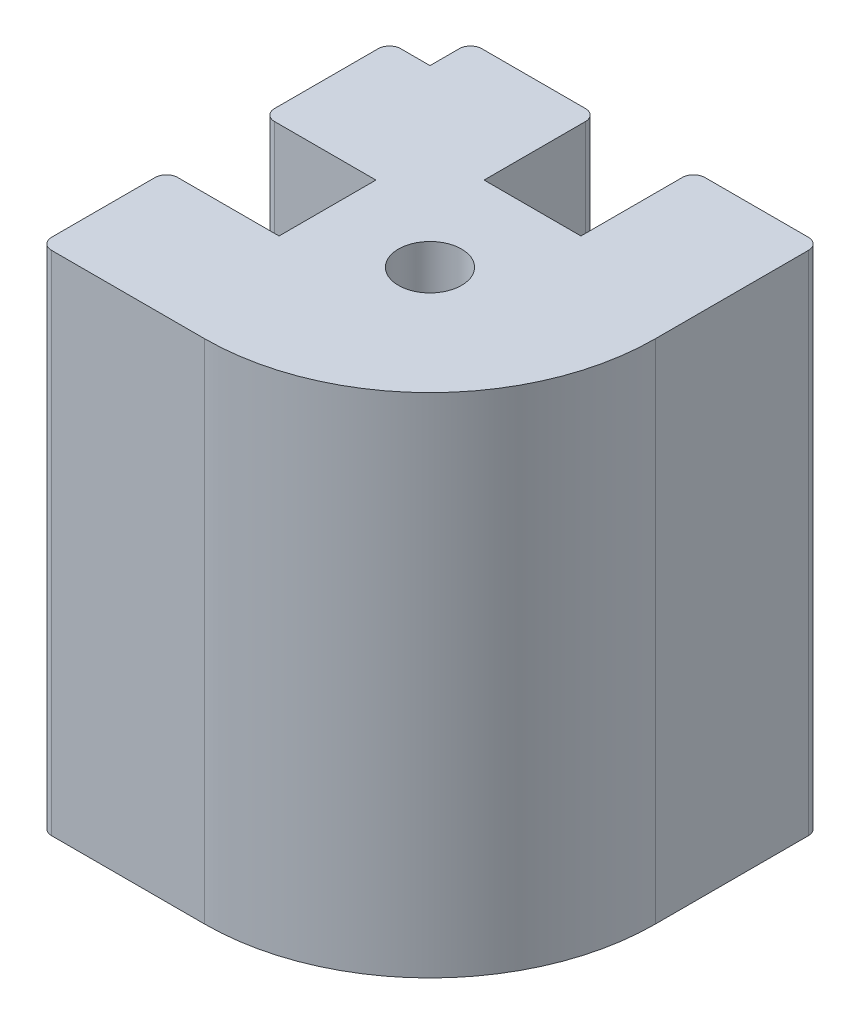
ISO-10303-21;
HEADER;
FILE_DESCRIPTION(('STEP AP214'),'2;1');
FILE_NAME('part.step','',(''),(''),'','','');
FILE_SCHEMA(('AUTOMOTIVE_DESIGN { 1 0 10303 214 1 1 1 1 }'));
ENDSEC;
DATA;
#1=APPLICATION_CONTEXT('core data for automotive mechanical design processes');
#2=APPLICATION_PROTOCOL_DEFINITION('international standard','automotive_design',2000,#1);
#3=PRODUCT_CONTEXT('',#1,'mechanical');
#4=PRODUCT('Part','Part','',(#3));
#5=PRODUCT_RELATED_PRODUCT_CATEGORY('part','',(#4));
#6=PRODUCT_DEFINITION_FORMATION('','',#4);
#7=PRODUCT_DEFINITION_CONTEXT('part definition',#1,'design');
#8=PRODUCT_DEFINITION('design','',#6,#7);
#9=PRODUCT_DEFINITION_SHAPE('','',#8);
#10=(LENGTH_UNIT() NAMED_UNIT(*) SI_UNIT(.MILLI.,.METRE.));
#11=(NAMED_UNIT(*) PLANE_ANGLE_UNIT() SI_UNIT($,.RADIAN.));
#12=(NAMED_UNIT(*) SI_UNIT($,.STERADIAN.) SOLID_ANGLE_UNIT());
#13=UNCERTAINTY_MEASURE_WITH_UNIT(LENGTH_MEASURE(1.E-05),#10,'distance_accuracy_value','');
#14=(GEOMETRIC_REPRESENTATION_CONTEXT(3) GLOBAL_UNCERTAINTY_ASSIGNED_CONTEXT((#13)) GLOBAL_UNIT_ASSIGNED_CONTEXT((#10,
#11,#12)) REPRESENTATION_CONTEXT('',''));
#15=CARTESIAN_POINT('',(0.,0.,0.));
#16=DIRECTION('',(0.,0.,1.));
#17=DIRECTION('',(1.,0.,0.));
#18=AXIS2_PLACEMENT_3D('',#15,#16,#17);
#19=CARTESIAN_POINT('',(0.,45.,0.));
#20=DIRECTION('',(0.,-1.,0.));
#21=DIRECTION('',(0.,0.,-1.));
#22=AXIS2_PLACEMENT_3D('',#19,#20,#21);
#23=PLANE('',#22);
#24=DIRECTION('',(1.,0.,0.));
#25=VECTOR('',#24,1.);
#26=CARTESIAN_POINT('',(15.5,45.,15.5));
#27=LINE('',#26,#25);
#28=CARTESIAN_POINT('',(-18.0991525423729,45.,15.5));
#29=VERTEX_POINT('',#28);
#30=CARTESIAN_POINT('',(-4.49999999999999,45.,15.5));
#31=VERTEX_POINT('',#30);
#32=EDGE_CURVE('E316',#29,#31,#27,.T.);
#33=ORIENTED_EDGE('',*,*,#32,.T.);
#34=CARTESIAN_POINT('',(-4.5,45.,-4.5));
#35=DIRECTION('',(0.,-1.,0.));
#36=DIRECTION('',(0.,0.,-1.));
#37=AXIS2_PLACEMENT_3D('',#34,#35,#36);
#38=CIRCLE('',#37,20.);
#39=CARTESIAN_POINT('',(15.5,45.,-4.5));
#40=VERTEX_POINT('',#39);
#41=EDGE_CURVE('E11',#31,#40,#38,.F.);
#42=ORIENTED_EDGE('',*,*,#41,.T.);
#43=DIRECTION('',(0.,0.,-1.));
#44=VECTOR('',#43,1.);
#45=CARTESIAN_POINT('',(15.5,45.,-19.0991525423729));
#46=LINE('',#45,#44);
#47=CARTESIAN_POINT('',(15.5,45.,-18.0991525423729));
#48=VERTEX_POINT('',#47);
#49=EDGE_CURVE('E444',#40,#48,#46,.T.);
#50=ORIENTED_EDGE('',*,*,#49,.T.);
#51=CARTESIAN_POINT('',(14.5,45.,-18.0991525423729));
#52=DIRECTION('',(0.,-1.,0.));
#53=DIRECTION('',(0.,0.,-1.));
#54=AXIS2_PLACEMENT_3D('',#51,#52,#53);
#55=CIRCLE('',#54,1.);
#56=CARTESIAN_POINT('',(14.5,45.,-19.0991525423729));
#57=VERTEX_POINT('',#56);
#58=EDGE_CURVE('E384',#48,#57,#55,.F.);
#59=ORIENTED_EDGE('',*,*,#58,.T.);
#60=DIRECTION('',(-1.,0.,0.));
#61=VECTOR('',#60,1.);
#62=CARTESIAN_POINT('',(4.3,45.,-19.0991525423729));
#63=LINE('',#62,#61);
#64=CARTESIAN_POINT('',(5.3,45.,-19.0991525423729));
#65=VERTEX_POINT('',#64);
#66=EDGE_CURVE('E212',#57,#65,#63,.T.);
#67=ORIENTED_EDGE('',*,*,#66,.T.);
#68=CARTESIAN_POINT('',(5.3,45.,-18.0991525423729));
#69=DIRECTION('',(0.,-1.,0.));
#70=DIRECTION('',(0.,0.,-1.));
#71=AXIS2_PLACEMENT_3D('',#68,#69,#70);
#72=CIRCLE('',#71,1.);
#73=CARTESIAN_POINT('',(4.3,45.,-18.0991525423729));
#74=VERTEX_POINT('',#73);
#75=EDGE_CURVE('E207',#65,#74,#72,.F.);
#76=ORIENTED_EDGE('',*,*,#75,.T.);
#77=DIRECTION('',(0.,0.,1.));
#78=VECTOR('',#77,1.);
#79=CARTESIAN_POINT('',(4.3,45.,-9.09915254237288));
#80=LINE('',#79,#78);
#81=CARTESIAN_POINT('',(4.3,45.,-9.09915254237288));
#82=VERTEX_POINT('',#81);
#83=EDGE_CURVE('E199',#74,#82,#80,.T.);
#84=ORIENTED_EDGE('',*,*,#83,.T.);
#85=DIRECTION('',(-1.,0.,0.));
#86=VECTOR('',#85,1.);
#87=CARTESIAN_POINT('',(-4.3,45.,-9.09915254237288));
#88=LINE('',#87,#86);
#89=CARTESIAN_POINT('',(-4.3,45.,-9.09915254237288));
#90=VERTEX_POINT('',#89);
#91=EDGE_CURVE('E202',#82,#90,#88,.T.);
#92=ORIENTED_EDGE('',*,*,#91,.T.);
#93=DIRECTION('',(0.,0.,-1.));
#94=VECTOR('',#93,1.);
#95=CARTESIAN_POINT('',(-4.3,45.,-19.0991525423729));
#96=LINE('',#95,#94);
#97=CARTESIAN_POINT('',(-4.3,45.,-18.0991525423729));
#98=VERTEX_POINT('',#97);
#99=EDGE_CURVE('E233',#90,#98,#96,.T.);
#100=ORIENTED_EDGE('',*,*,#99,.T.);
#101=CARTESIAN_POINT('',(-5.3,45.,-18.0991525423729));
#102=DIRECTION('',(0.,-1.,0.));
#103=DIRECTION('',(0.,0.,-1.));
#104=AXIS2_PLACEMENT_3D('',#101,#102,#103);
#105=CIRCLE('',#104,1.);
#106=CARTESIAN_POINT('',(-5.3,45.,-19.0991525423729));
#107=VERTEX_POINT('',#106);
#108=EDGE_CURVE('E379',#98,#107,#105,.F.);
#109=ORIENTED_EDGE('',*,*,#108,.T.);
#110=DIRECTION('',(-1.,0.,0.));
#111=VECTOR('',#110,1.);
#112=CARTESIAN_POINT('',(-15.5,45.,-19.0991525423729));
#113=LINE('',#112,#111);
#114=CARTESIAN_POINT('',(-14.5,45.,-19.0991525423729));
#115=VERTEX_POINT('',#114);
#116=EDGE_CURVE('E235',#107,#115,#113,.T.);
#117=ORIENTED_EDGE('',*,*,#116,.T.);
#118=CARTESIAN_POINT('',(-14.5,45.,-18.0991525423729));
#119=DIRECTION('',(0.,-1.,0.));
#120=DIRECTION('',(0.,0.,-1.));
#121=AXIS2_PLACEMENT_3D('',#118,#119,#120);
#122=CIRCLE('',#121,1.);
#123=CARTESIAN_POINT('',(-15.5,45.,-18.0991525423729));
#124=VERTEX_POINT('',#123);
#125=EDGE_CURVE('E380',#115,#124,#122,.F.);
#126=ORIENTED_EDGE('',*,*,#125,.T.);
#127=DIRECTION('',(0.,0.,1.));
#128=VECTOR('',#127,1.);
#129=CARTESIAN_POINT('',(-15.5,45.,-15.5));
#130=LINE('',#129,#128);
#131=CARTESIAN_POINT('',(-15.5,45.,-15.5));
#132=VERTEX_POINT('',#131);
#133=EDGE_CURVE('E243',#124,#132,#130,.T.);
#134=ORIENTED_EDGE('',*,*,#133,.T.);
#135=DIRECTION('',(-1.,0.,0.));
#136=VECTOR('',#135,1.);
#137=CARTESIAN_POINT('',(-19.0991525423729,45.,-15.5));
#138=LINE('',#137,#136);
#139=CARTESIAN_POINT('',(-18.0991525423729,45.,-15.5));
#140=VERTEX_POINT('',#139);
#141=EDGE_CURVE('E245',#132,#140,#138,.T.);
#142=ORIENTED_EDGE('',*,*,#141,.T.);
#143=CARTESIAN_POINT('',(-18.0991525423729,45.,-14.5));
#144=DIRECTION('',(0.,-1.,0.));
#145=DIRECTION('',(0.,0.,-1.));
#146=AXIS2_PLACEMENT_3D('',#143,#144,#145);
#147=CIRCLE('',#146,1.);
#148=CARTESIAN_POINT('',(-19.0991525423729,45.,-14.5));
#149=VERTEX_POINT('',#148);
#150=EDGE_CURVE('E372',#140,#149,#147,.F.);
#151=ORIENTED_EDGE('',*,*,#150,.T.);
#152=DIRECTION('',(0.,0.,1.));
#153=VECTOR('',#152,1.);
#154=CARTESIAN_POINT('',(-19.0991525423729,45.,-4.3));
#155=LINE('',#154,#153);
#156=CARTESIAN_POINT('',(-19.0991525423729,45.,-5.3));
#157=VERTEX_POINT('',#156);
#158=EDGE_CURVE('E247',#149,#157,#155,.T.);
#159=ORIENTED_EDGE('',*,*,#158,.T.);
#160=CARTESIAN_POINT('',(-18.0991525423729,45.,-5.3));
#161=DIRECTION('',(0.,-1.,0.));
#162=DIRECTION('',(0.,0.,-1.));
#163=AXIS2_PLACEMENT_3D('',#160,#161,#162);
#164=CIRCLE('',#163,1.);
#165=CARTESIAN_POINT('',(-18.0991525423729,45.,-4.3));
#166=VERTEX_POINT('',#165);
#167=EDGE_CURVE('E366',#157,#166,#164,.F.);
#168=ORIENTED_EDGE('',*,*,#167,.T.);
#169=DIRECTION('',(1.,0.,0.));
#170=VECTOR('',#169,1.);
#171=CARTESIAN_POINT('',(-9.09915254237288,45.,-4.3));
#172=LINE('',#171,#170);
#173=CARTESIAN_POINT('',(-9.09915254237288,45.,-4.3));
#174=VERTEX_POINT('',#173);
#175=EDGE_CURVE('E252',#166,#174,#172,.T.);
#176=ORIENTED_EDGE('',*,*,#175,.T.);
#177=DIRECTION('',(0.,0.,1.));
#178=VECTOR('',#177,1.);
#179=CARTESIAN_POINT('',(-9.09915254237288,45.,4.3));
#180=LINE('',#179,#178);
#181=CARTESIAN_POINT('',(-9.09915254237288,45.,4.3));
#182=VERTEX_POINT('',#181);
#183=EDGE_CURVE('E254',#174,#182,#180,.T.);
#184=ORIENTED_EDGE('',*,*,#183,.T.);
#185=DIRECTION('',(-1.,0.,0.));
#186=VECTOR('',#185,1.);
#187=CARTESIAN_POINT('',(-19.0991525423729,45.,4.3));
#188=LINE('',#187,#186);
#189=CARTESIAN_POINT('',(-18.0991525423729,45.,4.3));
#190=VERTEX_POINT('',#189);
#191=EDGE_CURVE('E256',#182,#190,#188,.T.);
#192=ORIENTED_EDGE('',*,*,#191,.T.);
#193=CARTESIAN_POINT('',(-18.0991525423729,45.,5.3));
#194=DIRECTION('',(0.,-1.,0.));
#195=DIRECTION('',(0.,0.,-1.));
#196=AXIS2_PLACEMENT_3D('',#193,#194,#195);
#197=CIRCLE('',#196,1.);
#198=CARTESIAN_POINT('',(-19.0991525423729,45.,5.3));
#199=VERTEX_POINT('',#198);
#200=EDGE_CURVE('E371',#190,#199,#197,.F.);
#201=ORIENTED_EDGE('',*,*,#200,.T.);
#202=DIRECTION('',(0.,0.,1.));
#203=VECTOR('',#202,1.);
#204=CARTESIAN_POINT('',(-19.0991525423729,45.,15.5));
#205=LINE('',#204,#203);
#206=CARTESIAN_POINT('',(-19.0991525423729,45.,14.5));
#207=VERTEX_POINT('',#206);
#208=EDGE_CURVE('E265',#199,#207,#205,.T.);
#209=ORIENTED_EDGE('',*,*,#208,.T.);
#210=CARTESIAN_POINT('',(-18.0991525423729,45.,14.5));
#211=DIRECTION('',(0.,-1.,0.));
#212=DIRECTION('',(0.,0.,-1.));
#213=AXIS2_PLACEMENT_3D('',#210,#211,#212);
#214=CIRCLE('',#213,1.);
#215=EDGE_CURVE('E364',#207,#29,#214,.F.);
#216=ORIENTED_EDGE('',*,*,#215,.T.);
#217=EDGE_LOOP('',(#33,#42,#50,#59,#67,#76,#84,#92,#100,#109,#117,#126,#134,#142,#151,#159,#168,
#176,#184,#192,#201,#209,#216));
#218=FACE_BOUND('',#217,.T.);
#219=CARTESIAN_POINT('',(0.,45.,0.));
#220=DIRECTION('',(0.,1.,0.));
#221=DIRECTION('',(0.,0.,1.));
#222=AXIS2_PLACEMENT_3D('',#219,#220,#221);
#223=CIRCLE('',#222,2.8);
#224=CARTESIAN_POINT('',(0.,45.,-2.8));
#225=VERTEX_POINT('',#224);
#226=EDGE_CURVE('E271',#225,#225,#223,.T.);
#227=ORIENTED_EDGE('',*,*,#226,.F.);
#228=EDGE_LOOP('',(#227));
#229=FACE_BOUND('',#228,.T.);
#230=ADVANCED_FACE('F44',(#218,#229),#23,.F.);
#231=CARTESIAN_POINT('',(0.,0.,0.));
#232=DIRECTION('',(0.,-1.,0.));
#233=DIRECTION('',(0.,0.,-1.));
#234=AXIS2_PLACEMENT_3D('',#231,#232,#233);
#235=PLANE('',#234);
#236=DIRECTION('',(0.,0.,-1.));
#237=VECTOR('',#236,1.);
#238=CARTESIAN_POINT('',(15.5,0.,-19.0991525423729));
#239=LINE('',#238,#237);
#240=CARTESIAN_POINT('',(15.5,0.,-4.5));
#241=VERTEX_POINT('',#240);
#242=CARTESIAN_POINT('',(15.5,0.,-18.0991525423729));
#243=VERTEX_POINT('',#242);
#244=EDGE_CURVE('E269',#241,#243,#239,.T.);
#245=ORIENTED_EDGE('',*,*,#244,.F.);
#246=CARTESIAN_POINT('',(-4.5,0.,-4.5));
#247=DIRECTION('',(0.,-1.,0.));
#248=DIRECTION('',(0.,0.,-1.));
#249=AXIS2_PLACEMENT_3D('',#246,#247,#248);
#250=CIRCLE('',#249,20.);
#251=CARTESIAN_POINT('',(-4.49999999999999,0.,15.5));
#252=VERTEX_POINT('',#251);
#253=EDGE_CURVE('E67',#241,#252,#250,.T.);
#254=ORIENTED_EDGE('',*,*,#253,.T.);
#255=DIRECTION('',(1.,0.,0.));
#256=VECTOR('',#255,1.);
#257=CARTESIAN_POINT('',(15.5,0.,15.5));
#258=LINE('',#257,#256);
#259=CARTESIAN_POINT('',(-18.0991525423729,0.,15.5));
#260=VERTEX_POINT('',#259);
#261=EDGE_CURVE('E270',#260,#252,#258,.T.);
#262=ORIENTED_EDGE('',*,*,#261,.F.);
#263=CARTESIAN_POINT('',(-18.0991525423729,0.,14.5));
#264=DIRECTION('',(0.,-1.,0.));
#265=DIRECTION('',(0.,0.,-1.));
#266=AXIS2_PLACEMENT_3D('',#263,#264,#265);
#267=CIRCLE('',#266,1.);
#268=CARTESIAN_POINT('',(-19.0991525423729,0.,14.5));
#269=VERTEX_POINT('',#268);
#270=EDGE_CURVE('E338',#260,#269,#267,.T.);
#271=ORIENTED_EDGE('',*,*,#270,.T.);
#272=DIRECTION('',(0.,0.,1.));
#273=VECTOR('',#272,1.);
#274=CARTESIAN_POINT('',(-19.0991525423729,0.,15.5));
#275=LINE('',#274,#273);
#276=CARTESIAN_POINT('',(-19.0991525423729,0.,5.3));
#277=VERTEX_POINT('',#276);
#278=EDGE_CURVE('E315',#277,#269,#275,.T.);
#279=ORIENTED_EDGE('',*,*,#278,.F.);
#280=CARTESIAN_POINT('',(-18.0991525423729,0.,5.3));
#281=DIRECTION('',(0.,-1.,0.));
#282=DIRECTION('',(0.,0.,-1.));
#283=AXIS2_PLACEMENT_3D('',#280,#281,#282);
#284=CIRCLE('',#283,1.);
#285=CARTESIAN_POINT('',(-18.0991525423729,0.,4.3));
#286=VERTEX_POINT('',#285);
#287=EDGE_CURVE('E344',#277,#286,#284,.T.);
#288=ORIENTED_EDGE('',*,*,#287,.T.);
#289=DIRECTION('',(-1.,0.,0.));
#290=VECTOR('',#289,1.);
#291=CARTESIAN_POINT('',(-19.0991525423729,0.,4.3));
#292=LINE('',#291,#290);
#293=CARTESIAN_POINT('',(-9.09915254237288,0.,4.3));
#294=VERTEX_POINT('',#293);
#295=EDGE_CURVE('E306',#294,#286,#292,.T.);
#296=ORIENTED_EDGE('',*,*,#295,.F.);
#297=DIRECTION('',(0.,0.,1.));
#298=VECTOR('',#297,1.);
#299=CARTESIAN_POINT('',(-9.09915254237288,0.,4.3));
#300=LINE('',#299,#298);
#301=CARTESIAN_POINT('',(-9.09915254237288,0.,-4.3));
#302=VERTEX_POINT('',#301);
#303=EDGE_CURVE('E301',#302,#294,#300,.T.);
#304=ORIENTED_EDGE('',*,*,#303,.F.);
#305=DIRECTION('',(1.,0.,0.));
#306=VECTOR('',#305,1.);
#307=CARTESIAN_POINT('',(-9.09915254237288,0.,-4.3));
#308=LINE('',#307,#306);
#309=CARTESIAN_POINT('',(-18.0991525423729,0.,-4.3));
#310=VERTEX_POINT('',#309);
#311=EDGE_CURVE('E304',#310,#302,#308,.T.);
#312=ORIENTED_EDGE('',*,*,#311,.F.);
#313=CARTESIAN_POINT('',(-18.0991525423729,0.,-5.3));
#314=DIRECTION('',(0.,-1.,0.));
#315=DIRECTION('',(0.,0.,-1.));
#316=AXIS2_PLACEMENT_3D('',#313,#314,#315);
#317=CIRCLE('',#316,1.);
#318=CARTESIAN_POINT('',(-19.0991525423729,0.,-5.3));
#319=VERTEX_POINT('',#318);
#320=EDGE_CURVE('E340',#310,#319,#317,.T.);
#321=ORIENTED_EDGE('',*,*,#320,.T.);
#322=DIRECTION('',(0.,0.,1.));
#323=VECTOR('',#322,1.);
#324=CARTESIAN_POINT('',(-19.0991525423729,0.,-4.3));
#325=LINE('',#324,#323);
#326=CARTESIAN_POINT('',(-19.0991525423729,0.,-14.5));
#327=VERTEX_POINT('',#326);
#328=EDGE_CURVE('E297',#327,#319,#325,.T.);
#329=ORIENTED_EDGE('',*,*,#328,.F.);
#330=CARTESIAN_POINT('',(-18.0991525423729,0.,-14.5));
#331=DIRECTION('',(0.,-1.,0.));
#332=DIRECTION('',(0.,0.,-1.));
#333=AXIS2_PLACEMENT_3D('',#330,#331,#332);
#334=CIRCLE('',#333,1.);
#335=CARTESIAN_POINT('',(-18.0991525423729,0.,-15.5));
#336=VERTEX_POINT('',#335);
#337=EDGE_CURVE('E341',#327,#336,#334,.T.);
#338=ORIENTED_EDGE('',*,*,#337,.T.);
#339=DIRECTION('',(-1.,0.,0.));
#340=VECTOR('',#339,1.);
#341=CARTESIAN_POINT('',(-19.0991525423729,0.,-15.5));
#342=LINE('',#341,#340);
#343=CARTESIAN_POINT('',(-15.5,0.,-15.5));
#344=VERTEX_POINT('',#343);
#345=EDGE_CURVE('E294',#344,#336,#342,.T.);
#346=ORIENTED_EDGE('',*,*,#345,.F.);
#347=DIRECTION('',(0.,0.,1.));
#348=VECTOR('',#347,1.);
#349=CARTESIAN_POINT('',(-15.5,0.,-15.5));
#350=LINE('',#349,#348);
#351=CARTESIAN_POINT('',(-15.5,0.,-18.0991525423729));
#352=VERTEX_POINT('',#351);
#353=EDGE_CURVE('E292',#352,#344,#350,.T.);
#354=ORIENTED_EDGE('',*,*,#353,.F.);
#355=CARTESIAN_POINT('',(-14.5,0.,-18.0991525423729));
#356=DIRECTION('',(0.,-1.,0.));
#357=DIRECTION('',(0.,0.,-1.));
#358=AXIS2_PLACEMENT_3D('',#355,#356,#357);
#359=CIRCLE('',#358,1.);
#360=CARTESIAN_POINT('',(-14.5,0.,-19.0991525423729));
#361=VERTEX_POINT('',#360);
#362=EDGE_CURVE('E346',#352,#361,#359,.T.);
#363=ORIENTED_EDGE('',*,*,#362,.T.);
#364=DIRECTION('',(-1.,0.,0.));
#365=VECTOR('',#364,1.);
#366=CARTESIAN_POINT('',(-15.5,0.,-19.0991525423729));
#367=LINE('',#366,#365);
#368=CARTESIAN_POINT('',(-5.3,0.,-19.0991525423729));
#369=VERTEX_POINT('',#368);
#370=EDGE_CURVE('E289',#369,#361,#367,.T.);
#371=ORIENTED_EDGE('',*,*,#370,.F.);
#372=CARTESIAN_POINT('',(-5.3,0.,-18.0991525423729));
#373=DIRECTION('',(0.,-1.,0.));
#374=DIRECTION('',(0.,0.,-1.));
#375=AXIS2_PLACEMENT_3D('',#372,#373,#374);
#376=CIRCLE('',#375,1.);
#377=CARTESIAN_POINT('',(-4.3,0.,-18.0991525423729));
#378=VERTEX_POINT('',#377);
#379=EDGE_CURVE('E353',#369,#378,#376,.T.);
#380=ORIENTED_EDGE('',*,*,#379,.T.);
#381=DIRECTION('',(0.,0.,-1.));
#382=VECTOR('',#381,1.);
#383=CARTESIAN_POINT('',(-4.3,0.,-19.0991525423729));
#384=LINE('',#383,#382);
#385=CARTESIAN_POINT('',(-4.3,0.,-9.09915254237288));
#386=VERTEX_POINT('',#385);
#387=EDGE_CURVE('E282',#386,#378,#384,.T.);
#388=ORIENTED_EDGE('',*,*,#387,.F.);
#389=DIRECTION('',(-1.,0.,0.));
#390=VECTOR('',#389,1.);
#391=CARTESIAN_POINT('',(-4.3,0.,-9.09915254237288));
#392=LINE('',#391,#390);
#393=CARTESIAN_POINT('',(4.3,0.,-9.09915254237288));
#394=VERTEX_POINT('',#393);
#395=EDGE_CURVE('E278',#394,#386,#392,.T.);
#396=ORIENTED_EDGE('',*,*,#395,.F.);
#397=DIRECTION('',(0.,0.,1.));
#398=VECTOR('',#397,1.);
#399=CARTESIAN_POINT('',(4.3,0.,-9.09915254237288));
#400=LINE('',#399,#398);
#401=CARTESIAN_POINT('',(4.3,0.,-18.0991525423729));
#402=VERTEX_POINT('',#401);
#403=EDGE_CURVE('E219',#402,#394,#400,.T.);
#404=ORIENTED_EDGE('',*,*,#403,.F.);
#405=CARTESIAN_POINT('',(5.3,0.,-18.0991525423729));
#406=DIRECTION('',(0.,-1.,0.));
#407=DIRECTION('',(0.,0.,-1.));
#408=AXIS2_PLACEMENT_3D('',#405,#406,#407);
#409=CIRCLE('',#408,1.);
#410=CARTESIAN_POINT('',(5.3,0.,-19.0991525423729));
#411=VERTEX_POINT('',#410);
#412=EDGE_CURVE('E355',#402,#411,#409,.T.);
#413=ORIENTED_EDGE('',*,*,#412,.T.);
#414=DIRECTION('',(-1.,0.,0.));
#415=VECTOR('',#414,1.);
#416=CARTESIAN_POINT('',(4.3,0.,-19.0991525423729));
#417=LINE('',#416,#415);
#418=CARTESIAN_POINT('',(14.5,0.,-19.0991525423729));
#419=VERTEX_POINT('',#418);
#420=EDGE_CURVE('E273',#419,#411,#417,.T.);
#421=ORIENTED_EDGE('',*,*,#420,.F.);
#422=CARTESIAN_POINT('',(14.5,0.,-18.0991525423729));
#423=DIRECTION('',(0.,-1.,0.));
#424=DIRECTION('',(0.,0.,-1.));
#425=AXIS2_PLACEMENT_3D('',#422,#423,#424);
#426=CIRCLE('',#425,1.);
#427=EDGE_CURVE('E359',#419,#243,#426,.T.);
#428=ORIENTED_EDGE('',*,*,#427,.T.);
#429=EDGE_LOOP('',(#245,#254,#262,#271,#279,#288,#296,#304,#312,#321,#329,#338,#346,#354,#363,
#371,#380,#388,#396,#404,#413,#421,#428));
#430=FACE_BOUND('',#429,.T.);
#431=CARTESIAN_POINT('',(0.,0.,0.));
#432=DIRECTION('',(0.,1.,0.));
#433=DIRECTION('',(0.,0.,1.));
#434=AXIS2_PLACEMENT_3D('',#431,#432,#433);
#435=CIRCLE('',#434,2.8);
#436=CARTESIAN_POINT('',(0.,0.,-2.8));
#437=VERTEX_POINT('',#436);
#438=EDGE_CURVE('E465',#437,#437,#435,.T.);
#439=ORIENTED_EDGE('',*,*,#438,.T.);
#440=EDGE_LOOP('',(#439));
#441=FACE_BOUND('',#440,.T.);
#442=ADVANCED_FACE('F448',(#430,#441),#235,.T.);
#443=CARTESIAN_POINT('',(15.5,45.,15.5));
#444=DIRECTION('',(0.,0.,-1.));
#445=DIRECTION('',(-1.,0.,0.));
#446=AXIS2_PLACEMENT_3D('',#443,#444,#445);
#447=PLANE('',#446);
#448=ORIENTED_EDGE('',*,*,#261,.T.);
#449=DIRECTION('',(0.,-1.,0.));
#450=VECTOR('',#449,1.);
#451=CARTESIAN_POINT('',(-4.49999999999999,45.,15.5));
#452=LINE('',#451,#450);
#453=EDGE_CURVE('E53',#252,#31,#452,.F.);
#454=ORIENTED_EDGE('',*,*,#453,.T.);
#455=ORIENTED_EDGE('',*,*,#32,.F.);
#456=DIRECTION('',(0.,-1.,0.));
#457=VECTOR('',#456,1.);
#458=CARTESIAN_POINT('',(-18.0991525423729,45.,15.5));
#459=LINE('',#458,#457);
#460=EDGE_CURVE('E427',#29,#260,#459,.T.);
#461=ORIENTED_EDGE('',*,*,#460,.T.);
#462=EDGE_LOOP('',(#448,#454,#455,#461));
#463=FACE_BOUND('',#462,.T.);
#464=ADVANCED_FACE('F477',(#463),#447,.F.);
#465=CARTESIAN_POINT('',(15.5,45.,-19.0991525423729));
#466=DIRECTION('',(-1.,0.,0.));
#467=DIRECTION('',(0.,0.,1.));
#468=AXIS2_PLACEMENT_3D('',#465,#466,#467);
#469=PLANE('',#468);
#470=ORIENTED_EDGE('',*,*,#49,.F.);
#471=DIRECTION('',(0.,-1.,0.));
#472=VECTOR('',#471,1.);
#473=CARTESIAN_POINT('',(15.5,45.,-4.5));
#474=LINE('',#473,#472);
#475=EDGE_CURVE('E433',#40,#241,#474,.T.);
#476=ORIENTED_EDGE('',*,*,#475,.T.);
#477=ORIENTED_EDGE('',*,*,#244,.T.);
#478=DIRECTION('',(0.,-1.,0.));
#479=VECTOR('',#478,1.);
#480=CARTESIAN_POINT('',(15.5,45.,-18.0991525423729));
#481=LINE('',#480,#479);
#482=EDGE_CURVE('E363',#243,#48,#481,.F.);
#483=ORIENTED_EDGE('',*,*,#482,.T.);
#484=EDGE_LOOP('',(#470,#476,#477,#483));
#485=FACE_BOUND('',#484,.T.);
#486=ADVANCED_FACE('F445',(#485),#469,.F.);
#487=CARTESIAN_POINT('',(4.3,45.,-19.0991525423729));
#488=DIRECTION('',(0.,0.,1.));
#489=DIRECTION('',(1.,0.,0.));
#490=AXIS2_PLACEMENT_3D('',#487,#488,#489);
#491=PLANE('',#490);
#492=ORIENTED_EDGE('',*,*,#66,.F.);
#493=DIRECTION('',(0.,-1.,0.));
#494=VECTOR('',#493,1.);
#495=CARTESIAN_POINT('',(14.5,45.,-19.0991525423729));
#496=LINE('',#495,#494);
#497=EDGE_CURVE('E335',#57,#419,#496,.T.);
#498=ORIENTED_EDGE('',*,*,#497,.T.);
#499=ORIENTED_EDGE('',*,*,#420,.T.);
#500=DIRECTION('',(0.,-1.,0.));
#501=VECTOR('',#500,1.);
#502=CARTESIAN_POINT('',(5.3,45.,-19.0991525423729));
#503=LINE('',#502,#501);
#504=EDGE_CURVE('E221',#411,#65,#503,.F.);
#505=ORIENTED_EDGE('',*,*,#504,.T.);
#506=EDGE_LOOP('',(#492,#498,#499,#505));
#507=FACE_BOUND('',#506,.T.);
#508=ADVANCED_FACE('F457',(#507),#491,.F.);
#509=CARTESIAN_POINT('',(4.3,45.,-9.09915254237288));
#510=DIRECTION('',(1.,0.,0.));
#511=DIRECTION('',(0.,0.,-1.));
#512=AXIS2_PLACEMENT_3D('',#509,#510,#511);
#513=PLANE('',#512);
#514=ORIENTED_EDGE('',*,*,#83,.F.);
#515=DIRECTION('',(0.,-1.,0.));
#516=VECTOR('',#515,1.);
#517=CARTESIAN_POINT('',(4.3,45.,-18.0991525423729));
#518=LINE('',#517,#516);
#519=EDGE_CURVE('E389',#74,#402,#518,.T.);
#520=ORIENTED_EDGE('',*,*,#519,.T.);
#521=ORIENTED_EDGE('',*,*,#403,.T.);
#522=DIRECTION('',(0.,-1.,0.));
#523=VECTOR('',#522,1.);
#524=CARTESIAN_POINT('',(4.3,45.,-9.09915254237288));
#525=LINE('',#524,#523);
#526=EDGE_CURVE('E220',#82,#394,#525,.T.);
#527=ORIENTED_EDGE('',*,*,#526,.F.);
#528=EDGE_LOOP('',(#514,#520,#521,#527));
#529=FACE_BOUND('',#528,.T.);
#530=ADVANCED_FACE('F217',(#529),#513,.F.);
#531=CARTESIAN_POINT('',(-4.3,45.,-9.09915254237288));
#532=DIRECTION('',(0.,0.,1.));
#533=DIRECTION('',(1.,0.,0.));
#534=AXIS2_PLACEMENT_3D('',#531,#532,#533);
#535=PLANE('',#534);
#536=ORIENTED_EDGE('',*,*,#395,.T.);
#537=DIRECTION('',(0.,-1.,0.));
#538=VECTOR('',#537,1.);
#539=CARTESIAN_POINT('',(-4.3,45.,-9.09915254237288));
#540=LINE('',#539,#538);
#541=EDGE_CURVE('E223',#90,#386,#540,.T.);
#542=ORIENTED_EDGE('',*,*,#541,.F.);
#543=ORIENTED_EDGE('',*,*,#91,.F.);
#544=ORIENTED_EDGE('',*,*,#526,.T.);
#545=EDGE_LOOP('',(#536,#542,#543,#544));
#546=FACE_BOUND('',#545,.T.);
#547=ADVANCED_FACE('F229',(#546),#535,.F.);
#548=CARTESIAN_POINT('',(-4.3,45.,-19.0991525423729));
#549=DIRECTION('',(-1.,0.,0.));
#550=DIRECTION('',(0.,0.,1.));
#551=AXIS2_PLACEMENT_3D('',#548,#549,#550);
#552=PLANE('',#551);
#553=ORIENTED_EDGE('',*,*,#387,.T.);
#554=DIRECTION('',(0.,-1.,0.));
#555=VECTOR('',#554,1.);
#556=CARTESIAN_POINT('',(-4.3,45.,-18.0991525423729));
#557=LINE('',#556,#555);
#558=EDGE_CURVE('E397',#378,#98,#557,.F.);
#559=ORIENTED_EDGE('',*,*,#558,.T.);
#560=ORIENTED_EDGE('',*,*,#99,.F.);
#561=ORIENTED_EDGE('',*,*,#541,.T.);
#562=EDGE_LOOP('',(#553,#559,#560,#561));
#563=FACE_BOUND('',#562,.T.);
#564=ADVANCED_FACE('F513',(#563),#552,.F.);
#565=CARTESIAN_POINT('',(-15.5,45.,-19.0991525423729));
#566=DIRECTION('',(0.,0.,1.));
#567=DIRECTION('',(1.,0.,0.));
#568=AXIS2_PLACEMENT_3D('',#565,#566,#567);
#569=PLANE('',#568);
#570=ORIENTED_EDGE('',*,*,#116,.F.);
#571=DIRECTION('',(0.,-1.,0.));
#572=VECTOR('',#571,1.);
#573=CARTESIAN_POINT('',(-5.3,45.,-19.0991525423729));
#574=LINE('',#573,#572);
#575=EDGE_CURVE('E395',#107,#369,#574,.T.);
#576=ORIENTED_EDGE('',*,*,#575,.T.);
#577=ORIENTED_EDGE('',*,*,#370,.T.);
#578=DIRECTION('',(0.,-1.,0.));
#579=VECTOR('',#578,1.);
#580=CARTESIAN_POINT('',(-14.5,45.,-19.0991525423729));
#581=LINE('',#580,#579);
#582=EDGE_CURVE('E393',#361,#115,#581,.F.);
#583=ORIENTED_EDGE('',*,*,#582,.T.);
#584=EDGE_LOOP('',(#570,#576,#577,#583));
#585=FACE_BOUND('',#584,.T.);
#586=ADVANCED_FACE('F512',(#585),#569,.F.);
#587=CARTESIAN_POINT('',(-15.5,45.,-15.5));
#588=DIRECTION('',(1.,0.,0.));
#589=DIRECTION('',(0.,0.,-1.));
#590=AXIS2_PLACEMENT_3D('',#587,#588,#589);
#591=PLANE('',#590);
#592=ORIENTED_EDGE('',*,*,#133,.F.);
#593=DIRECTION('',(0.,-1.,0.));
#594=VECTOR('',#593,1.);
#595=CARTESIAN_POINT('',(-15.5,45.,-18.0991525423729));
#596=LINE('',#595,#594);
#597=EDGE_CURVE('E402',#124,#352,#596,.T.);
#598=ORIENTED_EDGE('',*,*,#597,.T.);
#599=ORIENTED_EDGE('',*,*,#353,.T.);
#600=DIRECTION('',(0.,-1.,0.));
#601=VECTOR('',#600,1.);
#602=CARTESIAN_POINT('',(-15.5,45.,-15.5));
#603=LINE('',#602,#601);
#604=EDGE_CURVE('E322',#132,#344,#603,.T.);
#605=ORIENTED_EDGE('',*,*,#604,.F.);
#606=EDGE_LOOP('',(#592,#598,#599,#605));
#607=FACE_BOUND('',#606,.T.);
#608=ADVANCED_FACE('F509',(#607),#591,.F.);
#609=CARTESIAN_POINT('',(-19.0991525423729,45.,-15.5));
#610=DIRECTION('',(0.,0.,1.));
#611=DIRECTION('',(1.,0.,0.));
#612=AXIS2_PLACEMENT_3D('',#609,#610,#611);
#613=PLANE('',#612);
#614=ORIENTED_EDGE('',*,*,#345,.T.);
#615=DIRECTION('',(0.,-1.,0.));
#616=VECTOR('',#615,1.);
#617=CARTESIAN_POINT('',(-18.0991525423729,45.,-15.5));
#618=LINE('',#617,#616);
#619=EDGE_CURVE('E414',#336,#140,#618,.F.);
#620=ORIENTED_EDGE('',*,*,#619,.T.);
#621=ORIENTED_EDGE('',*,*,#141,.F.);
#622=ORIENTED_EDGE('',*,*,#604,.T.);
#623=EDGE_LOOP('',(#614,#620,#621,#622));
#624=FACE_BOUND('',#623,.T.);
#625=ADVANCED_FACE('F502',(#624),#613,.F.);
#626=CARTESIAN_POINT('',(-19.0991525423729,45.,-4.3));
#627=DIRECTION('',(1.,0.,0.));
#628=DIRECTION('',(0.,0.,-1.));
#629=AXIS2_PLACEMENT_3D('',#626,#627,#628);
#630=PLANE('',#629);
#631=ORIENTED_EDGE('',*,*,#158,.F.);
#632=DIRECTION('',(0.,-1.,0.));
#633=VECTOR('',#632,1.);
#634=CARTESIAN_POINT('',(-19.0991525423729,45.,-14.5));
#635=LINE('',#634,#633);
#636=EDGE_CURVE('E407',#149,#327,#635,.T.);
#637=ORIENTED_EDGE('',*,*,#636,.T.);
#638=ORIENTED_EDGE('',*,*,#328,.T.);
#639=DIRECTION('',(0.,-1.,0.));
#640=VECTOR('',#639,1.);
#641=CARTESIAN_POINT('',(-19.0991525423729,45.,-5.3));
#642=LINE('',#641,#640);
#643=EDGE_CURVE('E403',#319,#157,#642,.F.);
#644=ORIENTED_EDGE('',*,*,#643,.T.);
#645=EDGE_LOOP('',(#631,#637,#638,#644));
#646=FACE_BOUND('',#645,.T.);
#647=ADVANCED_FACE('F496',(#646),#630,.F.);
#648=CARTESIAN_POINT('',(-9.09915254237288,45.,-4.3));
#649=DIRECTION('',(0.,0.,-1.));
#650=DIRECTION('',(-1.,0.,0.));
#651=AXIS2_PLACEMENT_3D('',#648,#649,#650);
#652=PLANE('',#651);
#653=ORIENTED_EDGE('',*,*,#175,.F.);
#654=DIRECTION('',(0.,-1.,0.));
#655=VECTOR('',#654,1.);
#656=CARTESIAN_POINT('',(-18.0991525423729,45.,-4.3));
#657=LINE('',#656,#655);
#658=EDGE_CURVE('E422',#166,#310,#657,.T.);
#659=ORIENTED_EDGE('',*,*,#658,.T.);
#660=ORIENTED_EDGE('',*,*,#311,.T.);
#661=DIRECTION('',(0.,-1.,0.));
#662=VECTOR('',#661,1.);
#663=CARTESIAN_POINT('',(-9.09915254237288,45.,-4.3));
#664=LINE('',#663,#662);
#665=EDGE_CURVE('E319',#174,#302,#664,.T.);
#666=ORIENTED_EDGE('',*,*,#665,.F.);
#667=EDGE_LOOP('',(#653,#659,#660,#666));
#668=FACE_BOUND('',#667,.T.);
#669=ADVANCED_FACE('F494',(#668),#652,.F.);
#670=CARTESIAN_POINT('',(-9.09915254237288,45.,4.3));
#671=DIRECTION('',(1.,0.,0.));
#672=DIRECTION('',(0.,0.,-1.));
#673=AXIS2_PLACEMENT_3D('',#670,#671,#672);
#674=PLANE('',#673);
#675=ORIENTED_EDGE('',*,*,#303,.T.);
#676=DIRECTION('',(0.,-1.,0.));
#677=VECTOR('',#676,1.);
#678=CARTESIAN_POINT('',(-9.09915254237288,45.,4.3));
#679=LINE('',#678,#677);
#680=EDGE_CURVE('E266',#182,#294,#679,.T.);
#681=ORIENTED_EDGE('',*,*,#680,.F.);
#682=ORIENTED_EDGE('',*,*,#183,.F.);
#683=ORIENTED_EDGE('',*,*,#665,.T.);
#684=EDGE_LOOP('',(#675,#681,#682,#683));
#685=FACE_BOUND('',#684,.T.);
#686=ADVANCED_FACE('F491',(#685),#674,.F.);
#687=CARTESIAN_POINT('',(-19.0991525423729,45.,4.3));
#688=DIRECTION('',(0.,0.,1.));
#689=DIRECTION('',(1.,0.,0.));
#690=AXIS2_PLACEMENT_3D('',#687,#688,#689);
#691=PLANE('',#690);
#692=ORIENTED_EDGE('',*,*,#295,.T.);
#693=DIRECTION('',(0.,-1.,0.));
#694=VECTOR('',#693,1.);
#695=CARTESIAN_POINT('',(-18.0991525423729,45.,4.3));
#696=LINE('',#695,#694);
#697=EDGE_CURVE('E425',#286,#190,#696,.F.);
#698=ORIENTED_EDGE('',*,*,#697,.T.);
#699=ORIENTED_EDGE('',*,*,#191,.F.);
#700=ORIENTED_EDGE('',*,*,#680,.T.);
#701=EDGE_LOOP('',(#692,#698,#699,#700));
#702=FACE_BOUND('',#701,.T.);
#703=ADVANCED_FACE('F490',(#702),#691,.F.);
#704=CARTESIAN_POINT('',(-19.0991525423729,45.,15.5));
#705=DIRECTION('',(1.,0.,0.));
#706=DIRECTION('',(0.,0.,-1.));
#707=AXIS2_PLACEMENT_3D('',#704,#705,#706);
#708=PLANE('',#707);
#709=ORIENTED_EDGE('',*,*,#208,.F.);
#710=DIRECTION('',(0.,-1.,0.));
#711=VECTOR('',#710,1.);
#712=CARTESIAN_POINT('',(-19.0991525423729,45.,5.3));
#713=LINE('',#712,#711);
#714=EDGE_CURVE('E416',#199,#277,#713,.T.);
#715=ORIENTED_EDGE('',*,*,#714,.T.);
#716=ORIENTED_EDGE('',*,*,#278,.T.);
#717=DIRECTION('',(0.,-1.,0.));
#718=VECTOR('',#717,1.);
#719=CARTESIAN_POINT('',(-19.0991525423729,45.,14.5));
#720=LINE('',#719,#718);
#721=EDGE_CURVE('E411',#269,#207,#720,.F.);
#722=ORIENTED_EDGE('',*,*,#721,.T.);
#723=EDGE_LOOP('',(#709,#715,#716,#722));
#724=FACE_BOUND('',#723,.T.);
#725=ADVANCED_FACE('F482',(#724),#708,.F.);
#726=CARTESIAN_POINT('',(0.,45.,0.));
#727=DIRECTION('',(0.,-1.,0.));
#728=DIRECTION('',(0.,0.,-1.));
#729=AXIS2_PLACEMENT_3D('',#726,#727,#728);
#730=CYLINDRICAL_SURFACE('',#729,2.8);
#731=CARTESIAN_POINT('',(0.,45.,-2.8));
#732=CARTESIAN_POINT('',(0.,44.53125,-2.8));
#733=CARTESIAN_POINT('',(0.,44.0625,-2.8));
#734=CARTESIAN_POINT('',(0.,43.125,-2.8));
#735=CARTESIAN_POINT('',(0.,42.65625,-2.8));
#736=CARTESIAN_POINT('',(0.,41.71875,-2.8));
#737=CARTESIAN_POINT('',(0.,41.25,-2.8));
#738=CARTESIAN_POINT('',(0.,40.3125,-2.8));
#739=CARTESIAN_POINT('',(0.,39.84375,-2.8));
#740=CARTESIAN_POINT('',(0.,38.90625,-2.8));
#741=CARTESIAN_POINT('',(0.,38.4375,-2.8));
#742=CARTESIAN_POINT('',(0.,37.5,-2.8));
#743=CARTESIAN_POINT('',(0.,37.03125,-2.8));
#744=CARTESIAN_POINT('',(0.,36.09375,-2.8));
#745=CARTESIAN_POINT('',(0.,35.625,-2.8));
#746=CARTESIAN_POINT('',(0.,34.6875,-2.8));
#747=CARTESIAN_POINT('',(0.,34.21875,-2.8));
#748=CARTESIAN_POINT('',(0.,33.28125,-2.8));
#749=CARTESIAN_POINT('',(0.,32.8125,-2.8));
#750=CARTESIAN_POINT('',(0.,31.875,-2.8));
#751=CARTESIAN_POINT('',(0.,31.40625,-2.8));
#752=CARTESIAN_POINT('',(0.,30.46875,-2.8));
#753=CARTESIAN_POINT('',(0.,30.,-2.8));
#754=CARTESIAN_POINT('',(0.,29.0625,-2.8));
#755=CARTESIAN_POINT('',(0.,28.59375,-2.8));
#756=CARTESIAN_POINT('',(0.,27.65625,-2.8));
#757=CARTESIAN_POINT('',(0.,27.1875,-2.8));
#758=CARTESIAN_POINT('',(0.,26.25,-2.8));
#759=CARTESIAN_POINT('',(0.,25.78125,-2.8));
#760=CARTESIAN_POINT('',(0.,24.84375,-2.8));
#761=CARTESIAN_POINT('',(0.,24.375,-2.8));
#762=CARTESIAN_POINT('',(0.,23.4375,-2.8));
#763=CARTESIAN_POINT('',(0.,22.96875,-2.8));
#764=CARTESIAN_POINT('',(0.,22.03125,-2.8));
#765=CARTESIAN_POINT('',(0.,21.5625,-2.8));
#766=CARTESIAN_POINT('',(0.,20.625,-2.8));
#767=CARTESIAN_POINT('',(0.,20.15625,-2.8));
#768=CARTESIAN_POINT('',(0.,19.21875,-2.8));
#769=CARTESIAN_POINT('',(0.,18.75,-2.8));
#770=CARTESIAN_POINT('',(0.,17.8125,-2.8));
#771=CARTESIAN_POINT('',(0.,17.34375,-2.8));
#772=CARTESIAN_POINT('',(0.,16.40625,-2.8));
#773=CARTESIAN_POINT('',(0.,15.9375,-2.8));
#774=CARTESIAN_POINT('',(0.,15.,-2.8));
#775=CARTESIAN_POINT('',(0.,14.53125,-2.8));
#776=CARTESIAN_POINT('',(0.,13.59375,-2.8));
#777=CARTESIAN_POINT('',(0.,13.125,-2.8));
#778=CARTESIAN_POINT('',(0.,12.1875,-2.8));
#779=CARTESIAN_POINT('',(0.,11.71875,-2.8));
#780=CARTESIAN_POINT('',(0.,10.78125,-2.8));
#781=CARTESIAN_POINT('',(0.,10.3125,-2.8));
#782=CARTESIAN_POINT('',(0.,9.37499999999999,-2.8));
#783=CARTESIAN_POINT('',(0.,8.90624999999999,-2.8));
#784=CARTESIAN_POINT('',(0.,7.96874999999999,-2.8));
#785=CARTESIAN_POINT('',(0.,7.5,-2.8));
#786=CARTESIAN_POINT('',(0.,6.56249999999999,-2.8));
#787=CARTESIAN_POINT('',(0.,6.09374999999999,-2.8));
#788=CARTESIAN_POINT('',(0.,5.15624999999999,-2.8));
#789=CARTESIAN_POINT('',(0.,4.68749999999999,-2.8));
#790=CARTESIAN_POINT('',(0.,3.74999999999999,-2.8));
#791=CARTESIAN_POINT('',(0.,3.28124999999999,-2.8));
#792=CARTESIAN_POINT('',(0.,2.34374999999999,-2.8));
#793=CARTESIAN_POINT('',(0.,1.87499999999999,-2.8));
#794=CARTESIAN_POINT('',(0.,0.937499999999992,-2.8));
#795=CARTESIAN_POINT('',(0.,0.468749999999993,-2.8));
#796=CARTESIAN_POINT('',(0.,0.,-2.8));
#797=B_SPLINE_CURVE_WITH_KNOTS('',3,(#731,#732,#733,#734,#735,#736,#737,#738,#739,#740,#741,
#742,#743,#744,#745,#746,#747,#748,#749,#750,#751,#752,#753,#754,#755,#756,#757,#758,#759,#760,
#761,#762,#763,#764,#765,#766,#767,#768,#769,#770,#771,#772,#773,#774,#775,#776,#777,#778,#779,
#780,#781,#782,#783,#784,#785,#786,#787,#788,#789,#790,#791,#792,#793,#794,#795,#796),
.UNSPECIFIED.,.F.,.F.,(4,2,2,2,2,2,2,2,2,2,2,2,2,2,2,2,2,2,2,2,2,2,2,2,2,2,2,2,2,2,2,2,4),(0.,
1.40625,2.8125,4.21874999999999,5.625,7.03125,8.43749999999999,9.84375,11.25,12.65625,14.0625,
15.46875,16.875,18.28125,19.6875,21.09375,22.5,23.90625,25.3125,26.71875,28.125,29.53125,
30.9375,32.34375,33.75,35.15625,36.5625,37.96875,39.375,40.78125,42.1875,43.59375,45.),.UNSPECIFIED.);
#798=EDGE_CURVE('BSEAM472',#225,#437,#797,.T.);
#799=ORIENTED_EDGE('',*,*,#226,.T.);
#800=ORIENTED_EDGE('',*,*,#438,.F.);
#801=ORIENTED_EDGE('',*,*,#798,.T.);
#802=ORIENTED_EDGE('',*,*,#798,.F.);
#803=EDGE_LOOP('',(#799,#801,#800,#802));
#804=FACE_BOUND('',#803,.T.);
#805=ADVANCED_FACE('F472',(#804),#730,.F.);
#806=CARTESIAN_POINT('',(14.5,45.,-18.0991525423729));
#807=DIRECTION('',(0.,-1.,0.));
#808=DIRECTION('',(0.,0.,-1.));
#809=AXIS2_PLACEMENT_3D('',#806,#807,#808);
#810=CYLINDRICAL_SURFACE('',#809,1.);
#811=ORIENTED_EDGE('',*,*,#58,.F.);
#812=ORIENTED_EDGE('',*,*,#482,.F.);
#813=ORIENTED_EDGE('',*,*,#427,.F.);
#814=ORIENTED_EDGE('',*,*,#497,.F.);
#815=EDGE_LOOP('',(#811,#812,#813,#814));
#816=FACE_BOUND('',#815,.T.);
#817=ADVANCED_FACE('F452',(#816),#810,.T.);
#818=CARTESIAN_POINT('',(5.3,45.,-18.0991525423729));
#819=DIRECTION('',(0.,-1.,0.));
#820=DIRECTION('',(0.,0.,-1.));
#821=AXIS2_PLACEMENT_3D('',#818,#819,#820);
#822=CYLINDRICAL_SURFACE('',#821,1.);
#823=ORIENTED_EDGE('',*,*,#75,.F.);
#824=ORIENTED_EDGE('',*,*,#504,.F.);
#825=ORIENTED_EDGE('',*,*,#412,.F.);
#826=ORIENTED_EDGE('',*,*,#519,.F.);
#827=EDGE_LOOP('',(#823,#824,#825,#826));
#828=FACE_BOUND('',#827,.T.);
#829=ADVANCED_FACE('F535',(#828),#822,.T.);
#830=CARTESIAN_POINT('',(-5.3,45.,-18.0991525423729));
#831=DIRECTION('',(0.,-1.,0.));
#832=DIRECTION('',(0.,0.,-1.));
#833=AXIS2_PLACEMENT_3D('',#830,#831,#832);
#834=CYLINDRICAL_SURFACE('',#833,1.);
#835=ORIENTED_EDGE('',*,*,#108,.F.);
#836=ORIENTED_EDGE('',*,*,#558,.F.);
#837=ORIENTED_EDGE('',*,*,#379,.F.);
#838=ORIENTED_EDGE('',*,*,#575,.F.);
#839=EDGE_LOOP('',(#835,#836,#837,#838));
#840=FACE_BOUND('',#839,.T.);
#841=ADVANCED_FACE('F532',(#840),#834,.T.);
#842=CARTESIAN_POINT('',(-14.5,45.,-18.0991525423729));
#843=DIRECTION('',(0.,-1.,0.));
#844=DIRECTION('',(0.,0.,-1.));
#845=AXIS2_PLACEMENT_3D('',#842,#843,#844);
#846=CYLINDRICAL_SURFACE('',#845,1.);
#847=ORIENTED_EDGE('',*,*,#125,.F.);
#848=ORIENTED_EDGE('',*,*,#582,.F.);
#849=ORIENTED_EDGE('',*,*,#362,.F.);
#850=ORIENTED_EDGE('',*,*,#597,.F.);
#851=EDGE_LOOP('',(#847,#848,#849,#850));
#852=FACE_BOUND('',#851,.T.);
#853=ADVANCED_FACE('F537',(#852),#846,.T.);
#854=CARTESIAN_POINT('',(-18.0991525423729,45.,-14.5));
#855=DIRECTION('',(0.,-1.,0.));
#856=DIRECTION('',(0.,0.,-1.));
#857=AXIS2_PLACEMENT_3D('',#854,#855,#856);
#858=CYLINDRICAL_SURFACE('',#857,1.);
#859=ORIENTED_EDGE('',*,*,#150,.F.);
#860=ORIENTED_EDGE('',*,*,#619,.F.);
#861=ORIENTED_EDGE('',*,*,#337,.F.);
#862=ORIENTED_EDGE('',*,*,#636,.F.);
#863=EDGE_LOOP('',(#859,#860,#861,#862));
#864=FACE_BOUND('',#863,.T.);
#865=ADVANCED_FACE('F543',(#864),#858,.T.);
#866=CARTESIAN_POINT('',(-18.0991525423729,45.,5.3));
#867=DIRECTION('',(0.,-1.,0.));
#868=DIRECTION('',(0.,0.,-1.));
#869=AXIS2_PLACEMENT_3D('',#866,#867,#868);
#870=CYLINDRICAL_SURFACE('',#869,1.);
#871=ORIENTED_EDGE('',*,*,#200,.F.);
#872=ORIENTED_EDGE('',*,*,#697,.F.);
#873=ORIENTED_EDGE('',*,*,#287,.F.);
#874=ORIENTED_EDGE('',*,*,#714,.F.);
#875=EDGE_LOOP('',(#871,#872,#873,#874));
#876=FACE_BOUND('',#875,.T.);
#877=ADVANCED_FACE('F550',(#876),#870,.T.);
#878=CARTESIAN_POINT('',(-18.0991525423729,45.,-5.3));
#879=DIRECTION('',(0.,-1.,0.));
#880=DIRECTION('',(0.,0.,-1.));
#881=AXIS2_PLACEMENT_3D('',#878,#879,#880);
#882=CYLINDRICAL_SURFACE('',#881,1.);
#883=ORIENTED_EDGE('',*,*,#167,.F.);
#884=ORIENTED_EDGE('',*,*,#643,.F.);
#885=ORIENTED_EDGE('',*,*,#320,.F.);
#886=ORIENTED_EDGE('',*,*,#658,.F.);
#887=EDGE_LOOP('',(#883,#884,#885,#886));
#888=FACE_BOUND('',#887,.T.);
#889=ADVANCED_FACE('F552',(#888),#882,.T.);
#890=CARTESIAN_POINT('',(-18.0991525423729,45.,14.5));
#891=DIRECTION('',(0.,-1.,0.));
#892=DIRECTION('',(0.,0.,-1.));
#893=AXIS2_PLACEMENT_3D('',#890,#891,#892);
#894=CYLINDRICAL_SURFACE('',#893,1.);
#895=ORIENTED_EDGE('',*,*,#215,.F.);
#896=ORIENTED_EDGE('',*,*,#721,.F.);
#897=ORIENTED_EDGE('',*,*,#270,.F.);
#898=ORIENTED_EDGE('',*,*,#460,.F.);
#899=EDGE_LOOP('',(#895,#896,#897,#898));
#900=FACE_BOUND('',#899,.T.);
#901=ADVANCED_FACE('F551',(#900),#894,.T.);
#902=CARTESIAN_POINT('',(-4.5,45.,-4.5));
#903=DIRECTION('',(0.,-1.,0.));
#904=DIRECTION('',(0.,0.,-1.));
#905=AXIS2_PLACEMENT_3D('',#902,#903,#904);
#906=CYLINDRICAL_SURFACE('',#905,20.);
#907=ORIENTED_EDGE('',*,*,#41,.F.);
#908=ORIENTED_EDGE('',*,*,#453,.F.);
#909=ORIENTED_EDGE('',*,*,#253,.F.);
#910=ORIENTED_EDGE('',*,*,#475,.F.);
#911=EDGE_LOOP('',(#907,#908,#909,#910));
#912=FACE_BOUND('',#911,.T.);
#913=ADVANCED_FACE('F50',(#912),#906,.T.);
#914=CLOSED_SHELL('',(#230,#442,#464,#486,#508,#530,#547,#564,#586,#608,#625,#647,#669,#686,
#703,#725,#805,#817,#829,#841,#853,#865,#877,#889,#901,#913));
#915=MANIFOLD_SOLID_BREP('B2',#914);
#916=ADVANCED_BREP_SHAPE_REPRESENTATION('',(#18,#915),#14);
#917=SHAPE_DEFINITION_REPRESENTATION(#9,#916);
ENDSEC;
END-ISO-10303-21;
